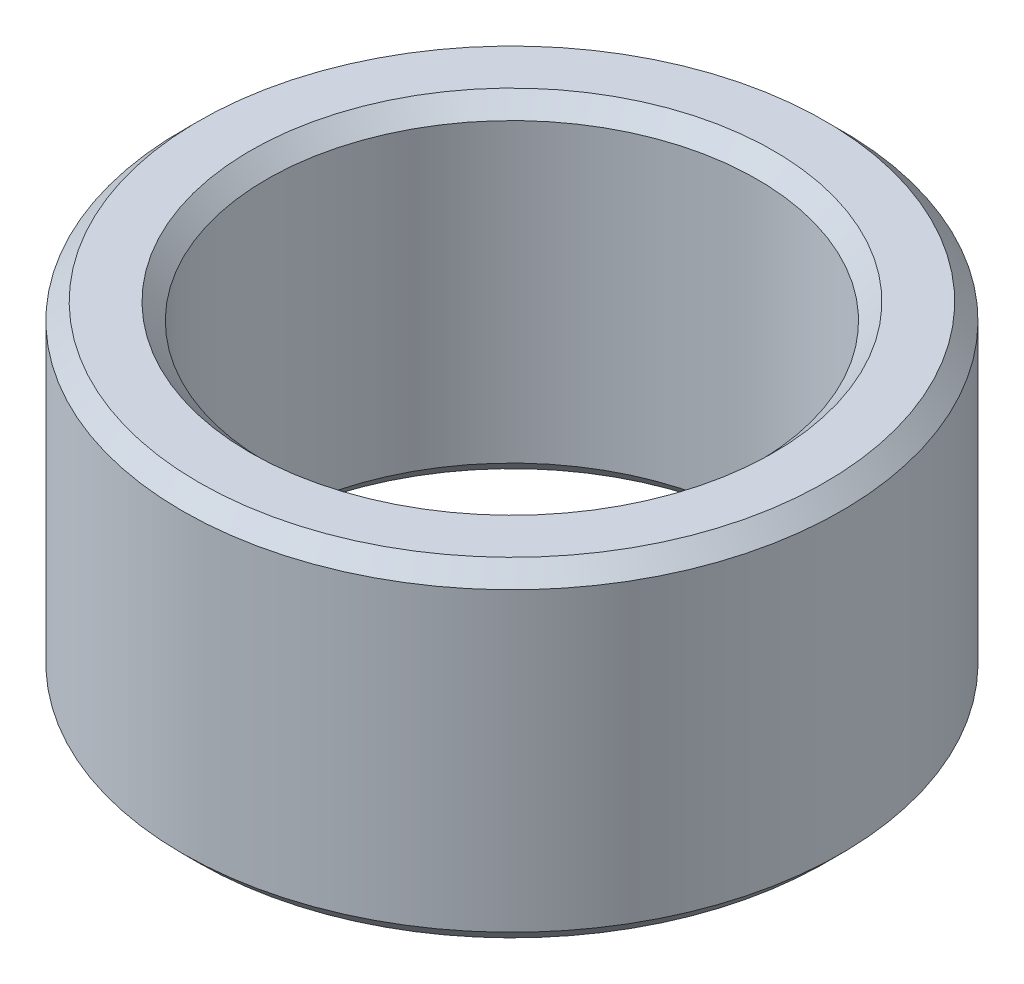
ISO-10303-21;
HEADER;
FILE_DESCRIPTION(('STEP AP214'),'2;1');
FILE_NAME('part.step','',(''),(''),'','','');
FILE_SCHEMA(('AUTOMOTIVE_DESIGN { 1 0 10303 214 1 1 1 1 }'));
ENDSEC;
DATA;
#1=APPLICATION_CONTEXT('core data for automotive mechanical design processes');
#2=APPLICATION_PROTOCOL_DEFINITION('international standard','automotive_design',2000,#1);
#3=PRODUCT_CONTEXT('',#1,'mechanical');
#4=PRODUCT('Part','Part','',(#3));
#5=PRODUCT_RELATED_PRODUCT_CATEGORY('part','',(#4));
#6=PRODUCT_DEFINITION_FORMATION('','',#4);
#7=PRODUCT_DEFINITION_CONTEXT('part definition',#1,'design');
#8=PRODUCT_DEFINITION('design','',#6,#7);
#9=PRODUCT_DEFINITION_SHAPE('','',#8);
#10=(LENGTH_UNIT() NAMED_UNIT(*) SI_UNIT(.MILLI.,.METRE.));
#11=(NAMED_UNIT(*) PLANE_ANGLE_UNIT() SI_UNIT($,.RADIAN.));
#12=(NAMED_UNIT(*) SI_UNIT($,.STERADIAN.) SOLID_ANGLE_UNIT());
#13=UNCERTAINTY_MEASURE_WITH_UNIT(LENGTH_MEASURE(1.E-05),#10,'distance_accuracy_value','');
#14=(GEOMETRIC_REPRESENTATION_CONTEXT(3) GLOBAL_UNCERTAINTY_ASSIGNED_CONTEXT((#13)) GLOBAL_UNIT_ASSIGNED_CONTEXT((#10,
#11,#12)) REPRESENTATION_CONTEXT('',''));
#15=CARTESIAN_POINT('',(0.,0.,0.));
#16=DIRECTION('',(0.,0.,1.));
#17=DIRECTION('',(1.,0.,0.));
#18=AXIS2_PLACEMENT_3D('',#15,#16,#17);
#19=CARTESIAN_POINT('',(0.,4.,0.));
#20=DIRECTION('',(0.,1.,0.));
#21=DIRECTION('',(0.,0.,1.));
#22=AXIS2_PLACEMENT_3D('',#19,#20,#21);
#23=PLANE('',#22);
#24=CARTESIAN_POINT('',(0.,4.,0.));
#25=DIRECTION('',(0.,1.,0.));
#26=DIRECTION('',(0.,0.,1.));
#27=AXIS2_PLACEMENT_3D('',#24,#25,#26);
#28=CIRCLE('',#27,3.8);
#29=CARTESIAN_POINT('',(0.,4.,3.8));
#30=VERTEX_POINT('',#29);
#31=EDGE_CURVE('E10',#30,#30,#28,.T.);
#32=ORIENTED_EDGE('',*,*,#31,.T.);
#33=EDGE_LOOP('',(#32));
#34=FACE_BOUND('',#33,.T.);
#35=CARTESIAN_POINT('',(0.,4.,0.));
#36=DIRECTION('',(0.,1.,0.));
#37=DIRECTION('',(0.,0.,1.));
#38=AXIS2_PLACEMENT_3D('',#35,#36,#37);
#39=CIRCLE('',#38,3.175);
#40=CARTESIAN_POINT('',(0.,4.,3.175));
#41=VERTEX_POINT('',#40);
#42=EDGE_CURVE('E49',#41,#41,#39,.F.);
#43=ORIENTED_EDGE('',*,*,#42,.T.);
#44=EDGE_LOOP('',(#43));
#45=FACE_BOUND('',#44,.T.);
#46=ADVANCED_FACE('F41',(#34,#45),#23,.T.);
#47=CARTESIAN_POINT('',(0.,0.,0.));
#48=DIRECTION('',(0.,1.,0.));
#49=DIRECTION('',(0.,0.,1.));
#50=AXIS2_PLACEMENT_3D('',#47,#48,#49);
#51=PLANE('',#50);
#52=CARTESIAN_POINT('',(0.,0.,0.));
#53=DIRECTION('',(0.,1.,0.));
#54=DIRECTION('',(0.,0.,1.));
#55=AXIS2_PLACEMENT_3D('',#52,#53,#54);
#56=CIRCLE('',#55,3.175);
#57=CARTESIAN_POINT('',(0.,0.,3.175));
#58=VERTEX_POINT('',#57);
#59=EDGE_CURVE('E68',#58,#58,#56,.T.);
#60=ORIENTED_EDGE('',*,*,#59,.T.);
#61=EDGE_LOOP('',(#60));
#62=FACE_BOUND('',#61,.T.);
#63=CARTESIAN_POINT('',(0.,0.,0.));
#64=DIRECTION('',(0.,1.,0.));
#65=DIRECTION('',(0.,0.,1.));
#66=AXIS2_PLACEMENT_3D('',#63,#64,#65);
#67=CIRCLE('',#66,3.8);
#68=CARTESIAN_POINT('',(0.,0.,3.8));
#69=VERTEX_POINT('',#68);
#70=EDGE_CURVE('E71',#69,#69,#67,.F.);
#71=ORIENTED_EDGE('',*,*,#70,.T.);
#72=EDGE_LOOP('',(#71));
#73=FACE_BOUND('',#72,.T.);
#74=ADVANCED_FACE('F75',(#62,#73),#51,.F.);
#75=CARTESIAN_POINT('',(0.,4.,0.));
#76=DIRECTION('',(0.,-1.,0.));
#77=DIRECTION('',(0.,0.,-1.));
#78=AXIS2_PLACEMENT_3D('',#75,#76,#77);
#79=CYLINDRICAL_SURFACE('',#78,4.);
#80=CARTESIAN_POINT('',(0.,0.200000000000001,0.));
#81=DIRECTION('',(0.,1.,0.));
#82=DIRECTION('',(0.,0.,1.));
#83=AXIS2_PLACEMENT_3D('',#80,#81,#82);
#84=CIRCLE('',#83,4.);
#85=CARTESIAN_POINT('',(0.,0.200000000000001,4.));
#86=VERTEX_POINT('',#85);
#87=EDGE_CURVE('E53',#86,#86,#84,.T.);
#88=ORIENTED_EDGE('',*,*,#87,.T.);
#89=EDGE_LOOP('',(#88));
#90=FACE_BOUND('',#89,.T.);
#91=CARTESIAN_POINT('',(0.,3.8,0.));
#92=DIRECTION('',(0.,1.,0.));
#93=DIRECTION('',(0.,0.,1.));
#94=AXIS2_PLACEMENT_3D('',#91,#92,#93);
#95=CIRCLE('',#94,4.);
#96=CARTESIAN_POINT('',(0.,3.8,4.));
#97=VERTEX_POINT('',#96);
#98=EDGE_CURVE('E57',#97,#97,#95,.F.);
#99=ORIENTED_EDGE('',*,*,#98,.T.);
#100=EDGE_LOOP('',(#99));
#101=FACE_BOUND('',#100,.T.);
#102=ADVANCED_FACE('F85',(#90,#101),#79,.T.);
#103=CARTESIAN_POINT('',(0.,4.,0.));
#104=DIRECTION('',(0.,-1.,0.));
#105=DIRECTION('',(0.,0.,-1.));
#106=AXIS2_PLACEMENT_3D('',#103,#104,#105);
#107=CYLINDRICAL_SURFACE('',#106,2.975);
#108=CARTESIAN_POINT('',(0.,0.200000000000001,0.));
#109=DIRECTION('',(0.,1.,0.));
#110=DIRECTION('',(0.,0.,1.));
#111=AXIS2_PLACEMENT_3D('',#108,#109,#110);
#112=CIRCLE('',#111,2.975);
#113=CARTESIAN_POINT('',(0.,0.200000000000001,2.975));
#114=VERTEX_POINT('',#113);
#115=EDGE_CURVE('E62',#114,#114,#112,.F.);
#116=ORIENTED_EDGE('',*,*,#115,.T.);
#117=EDGE_LOOP('',(#116));
#118=FACE_BOUND('',#117,.T.);
#119=CARTESIAN_POINT('',(0.,3.8,0.));
#120=DIRECTION('',(0.,1.,0.));
#121=DIRECTION('',(0.,0.,1.));
#122=AXIS2_PLACEMENT_3D('',#119,#120,#121);
#123=CIRCLE('',#122,2.975);
#124=CARTESIAN_POINT('',(0.,3.8,2.975));
#125=VERTEX_POINT('',#124);
#126=EDGE_CURVE('E65',#125,#125,#123,.T.);
#127=ORIENTED_EDGE('',*,*,#126,.T.);
#128=EDGE_LOOP('',(#127));
#129=FACE_BOUND('',#128,.T.);
#130=ADVANCED_FACE('F88',(#118,#129),#107,.F.);
#131=CARTESIAN_POINT('',(0.,0.,0.));
#132=DIRECTION('',(0.,-1.,0.));
#133=DIRECTION('',(0.,0.,-1.));
#134=AXIS2_PLACEMENT_3D('',#131,#132,#133);
#135=CONICAL_SURFACE('',#134,3.175,0.785398163397448);
#136=ORIENTED_EDGE('',*,*,#115,.F.);
#137=EDGE_LOOP('',(#136));
#138=FACE_BOUND('',#137,.T.);
#139=ORIENTED_EDGE('',*,*,#59,.F.);
#140=EDGE_LOOP('',(#139));
#141=FACE_BOUND('',#140,.T.);
#142=ADVANCED_FACE('F81',(#138,#141),#135,.F.);
#143=CARTESIAN_POINT('',(0.,0.200000000000001,0.));
#144=DIRECTION('',(0.,1.,0.));
#145=DIRECTION('',(0.,0.,1.));
#146=AXIS2_PLACEMENT_3D('',#143,#144,#145);
#147=CONICAL_SURFACE('',#146,4.,0.78539816339745);
#148=ORIENTED_EDGE('',*,*,#70,.F.);
#149=EDGE_LOOP('',(#148));
#150=FACE_BOUND('',#149,.T.);
#151=ORIENTED_EDGE('',*,*,#87,.F.);
#152=EDGE_LOOP('',(#151));
#153=FACE_BOUND('',#152,.T.);
#154=ADVANCED_FACE('F77',(#150,#153),#147,.T.);
#155=CARTESIAN_POINT('',(0.,4.,0.));
#156=DIRECTION('',(0.,-1.,0.));
#157=DIRECTION('',(0.,0.,-1.));
#158=AXIS2_PLACEMENT_3D('',#155,#156,#157);
#159=CONICAL_SURFACE('',#158,3.8,0.785398163397448);
#160=ORIENTED_EDGE('',*,*,#98,.F.);
#161=EDGE_LOOP('',(#160));
#162=FACE_BOUND('',#161,.T.);
#163=ORIENTED_EDGE('',*,*,#31,.F.);
#164=EDGE_LOOP('',(#163));
#165=FACE_BOUND('',#164,.T.);
#166=ADVANCED_FACE('F80',(#162,#165),#159,.T.);
#167=CARTESIAN_POINT('',(0.,3.8,0.));
#168=DIRECTION('',(0.,1.,0.));
#169=DIRECTION('',(0.,0.,1.));
#170=AXIS2_PLACEMENT_3D('',#167,#168,#169);
#171=CONICAL_SURFACE('',#170,2.975,0.785398163397453);
#172=CARTESIAN_POINT('',(0.,4.,3.175));
#173=CARTESIAN_POINT('',(0.,3.99791666666667,3.17291666666667));
#174=CARTESIAN_POINT('',(0.,3.99583333333333,3.17083333333333));
#175=CARTESIAN_POINT('',(0.,3.99166666666667,3.16666666666667));
#176=CARTESIAN_POINT('',(0.,3.98958333333333,3.16458333333333));
#177=CARTESIAN_POINT('',(0.,3.98541666666667,3.16041666666667));
#178=CARTESIAN_POINT('',(0.,3.98333333333333,3.15833333333333));
#179=CARTESIAN_POINT('',(0.,3.97916666666667,3.15416666666667));
#180=CARTESIAN_POINT('',(0.,3.97708333333333,3.15208333333333));
#181=CARTESIAN_POINT('',(0.,3.97291666666667,3.14791666666667));
#182=CARTESIAN_POINT('',(0.,3.97083333333333,3.14583333333333));
#183=CARTESIAN_POINT('',(0.,3.96666666666667,3.14166666666667));
#184=CARTESIAN_POINT('',(0.,3.96458333333333,3.13958333333333));
#185=CARTESIAN_POINT('',(0.,3.96041666666667,3.13541666666667));
#186=CARTESIAN_POINT('',(0.,3.95833333333333,3.13333333333333));
#187=CARTESIAN_POINT('',(0.,3.95416666666667,3.12916666666667));
#188=CARTESIAN_POINT('',(0.,3.95208333333333,3.12708333333333));
#189=CARTESIAN_POINT('',(0.,3.94791666666667,3.12291666666667));
#190=CARTESIAN_POINT('',(0.,3.94583333333333,3.12083333333333));
#191=CARTESIAN_POINT('',(0.,3.94166666666667,3.11666666666667));
#192=CARTESIAN_POINT('',(0.,3.93958333333333,3.11458333333333));
#193=CARTESIAN_POINT('',(0.,3.93541666666667,3.11041666666667));
#194=CARTESIAN_POINT('',(0.,3.93333333333333,3.10833333333333));
#195=CARTESIAN_POINT('',(0.,3.92916666666667,3.10416666666667));
#196=CARTESIAN_POINT('',(0.,3.92708333333333,3.10208333333333));
#197=CARTESIAN_POINT('',(0.,3.92291666666667,3.09791666666667));
#198=CARTESIAN_POINT('',(0.,3.92083333333333,3.09583333333333));
#199=CARTESIAN_POINT('',(0.,3.91666666666667,3.09166666666667));
#200=CARTESIAN_POINT('',(0.,3.91458333333333,3.08958333333333));
#201=CARTESIAN_POINT('',(0.,3.91041666666667,3.08541666666667));
#202=CARTESIAN_POINT('',(0.,3.90833333333333,3.08333333333333));
#203=CARTESIAN_POINT('',(0.,3.90416666666667,3.07916666666667));
#204=CARTESIAN_POINT('',(0.,3.90208333333333,3.07708333333333));
#205=CARTESIAN_POINT('',(0.,3.89791666666667,3.07291666666667));
#206=CARTESIAN_POINT('',(0.,3.89583333333333,3.07083333333333));
#207=CARTESIAN_POINT('',(0.,3.89166666666667,3.06666666666667));
#208=CARTESIAN_POINT('',(0.,3.88958333333333,3.06458333333333));
#209=CARTESIAN_POINT('',(0.,3.88541666666667,3.06041666666667));
#210=CARTESIAN_POINT('',(0.,3.88333333333333,3.05833333333333));
#211=CARTESIAN_POINT('',(0.,3.87916666666667,3.05416666666667));
#212=CARTESIAN_POINT('',(0.,3.87708333333333,3.05208333333333));
#213=CARTESIAN_POINT('',(0.,3.87291666666667,3.04791666666667));
#214=CARTESIAN_POINT('',(0.,3.87083333333333,3.04583333333333));
#215=CARTESIAN_POINT('',(0.,3.86666666666667,3.04166666666667));
#216=CARTESIAN_POINT('',(0.,3.86458333333333,3.03958333333333));
#217=CARTESIAN_POINT('',(0.,3.86041666666667,3.03541666666667));
#218=CARTESIAN_POINT('',(0.,3.85833333333333,3.03333333333333));
#219=CARTESIAN_POINT('',(0.,3.85416666666667,3.02916666666667));
#220=CARTESIAN_POINT('',(0.,3.85208333333333,3.02708333333333));
#221=CARTESIAN_POINT('',(0.,3.84791666666667,3.02291666666667));
#222=CARTESIAN_POINT('',(0.,3.84583333333333,3.02083333333333));
#223=CARTESIAN_POINT('',(0.,3.84166666666667,3.01666666666667));
#224=CARTESIAN_POINT('',(0.,3.83958333333333,3.01458333333333));
#225=CARTESIAN_POINT('',(0.,3.83541666666667,3.01041666666667));
#226=CARTESIAN_POINT('',(0.,3.83333333333333,3.00833333333333));
#227=CARTESIAN_POINT('',(0.,3.82916666666667,3.00416666666667));
#228=CARTESIAN_POINT('',(0.,3.82708333333333,3.00208333333333));
#229=CARTESIAN_POINT('',(0.,3.82291666666667,2.99791666666667));
#230=CARTESIAN_POINT('',(0.,3.82083333333333,2.99583333333333));
#231=CARTESIAN_POINT('',(0.,3.81666666666667,2.99166666666667));
#232=CARTESIAN_POINT('',(0.,3.81458333333333,2.98958333333333));
#233=CARTESIAN_POINT('',(0.,3.81041666666667,2.98541666666667));
#234=CARTESIAN_POINT('',(0.,3.80833333333333,2.98333333333333));
#235=CARTESIAN_POINT('',(0.,3.80416666666667,2.97916666666667));
#236=CARTESIAN_POINT('',(0.,3.80208333333333,2.97708333333333));
#237=CARTESIAN_POINT('',(0.,3.8,2.975));
#238=B_SPLINE_CURVE_WITH_KNOTS('',3,(#172,#173,#174,#175,#176,#177,#178,#179,#180,#181,#182,
#183,#184,#185,#186,#187,#188,#189,#190,#191,#192,#193,#194,#195,#196,#197,#198,#199,#200,#201,
#202,#203,#204,#205,#206,#207,#208,#209,#210,#211,#212,#213,#214,#215,#216,#217,#218,#219,#220,
#221,#222,#223,#224,#225,#226,#227,#228,#229,#230,#231,#232,#233,#234,#235,#236,#237),
.UNSPECIFIED.,.F.,.F.,(4,2,2,2,2,2,2,2,2,2,2,2,2,2,2,2,2,2,2,2,2,2,2,2,2,2,2,2,2,2,2,2,4),(0.,
0.00883883476483148,0.0176776695296633,0.0265165042944954,0.0353553390593275,0.0441941738241586,
0.0530330085889907,0.0618718433538228,0.0707106781186546,0.0795495128834861,0.0883883476483179,
0.09722718241315,0.106066017177982,0.114904851942813,0.123743686707645,0.132582521472477,
0.141421356237309,0.150260191002141,0.159099025766973,0.167937860531805,0.176776695296636,
0.185615530061468,0.1944543648263,0.203293199591132,0.212132034355964,0.220970869120796,
0.229809703885628,0.238648538650459,0.247487373415291,0.256326208180123,0.265165042944955,
0.274003877709787,0.282842712474619),.UNSPECIFIED.);
#239=EDGE_CURVE('BSEAM44',#41,#125,#238,.T.);
#240=ORIENTED_EDGE('',*,*,#42,.F.);
#241=ORIENTED_EDGE('',*,*,#126,.F.);
#242=ORIENTED_EDGE('',*,*,#239,.T.);
#243=ORIENTED_EDGE('',*,*,#239,.F.);
#244=EDGE_LOOP('',(#240,#242,#241,#243));
#245=FACE_BOUND('',#244,.T.);
#246=ADVANCED_FACE('F44',(#245),#171,.F.);
#247=CLOSED_SHELL('',(#46,#74,#102,#130,#142,#154,#166,#246));
#248=MANIFOLD_SOLID_BREP('B2',#247);
#249=ADVANCED_BREP_SHAPE_REPRESENTATION('',(#18,#248),#14);
#250=SHAPE_DEFINITION_REPRESENTATION(#9,#249);
ENDSEC;
END-ISO-10303-21;
